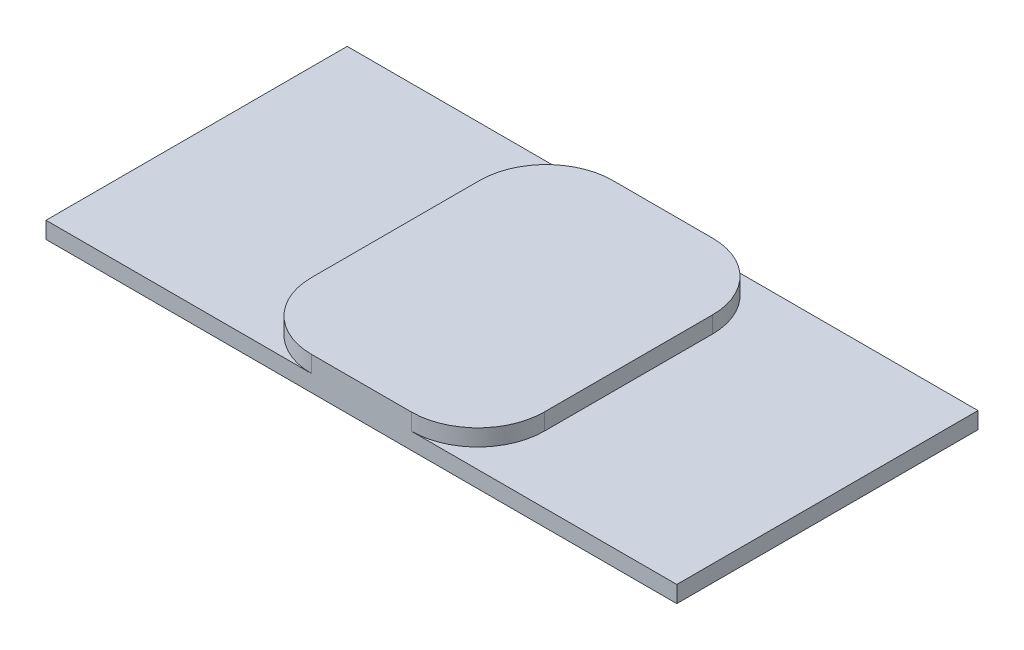
ISO-10303-21;
HEADER;
FILE_DESCRIPTION(('STEP AP214'),'2;1');
FILE_NAME('part.step','',(''),(''),'','','');
FILE_SCHEMA(('AUTOMOTIVE_DESIGN { 1 0 10303 214 1 1 1 1 }'));
ENDSEC;
DATA;
#1=APPLICATION_CONTEXT('core data for automotive mechanical design processes');
#2=APPLICATION_PROTOCOL_DEFINITION('international standard','automotive_design',2000,#1);
#3=PRODUCT_CONTEXT('',#1,'mechanical');
#4=PRODUCT('Part','Part','',(#3));
#5=PRODUCT_RELATED_PRODUCT_CATEGORY('part','',(#4));
#6=PRODUCT_DEFINITION_FORMATION('','',#4);
#7=PRODUCT_DEFINITION_CONTEXT('part definition',#1,'design');
#8=PRODUCT_DEFINITION('design','',#6,#7);
#9=PRODUCT_DEFINITION_SHAPE('','',#8);
#10=(LENGTH_UNIT() NAMED_UNIT(*) SI_UNIT(.MILLI.,.METRE.));
#11=(NAMED_UNIT(*) PLANE_ANGLE_UNIT() SI_UNIT($,.RADIAN.));
#12=(NAMED_UNIT(*) SI_UNIT($,.STERADIAN.) SOLID_ANGLE_UNIT());
#13=UNCERTAINTY_MEASURE_WITH_UNIT(LENGTH_MEASURE(1.E-05),#10,'distance_accuracy_value','');
#14=(GEOMETRIC_REPRESENTATION_CONTEXT(3) GLOBAL_UNCERTAINTY_ASSIGNED_CONTEXT((#13)) GLOBAL_UNIT_ASSIGNED_CONTEXT((#10,
#11,#12)) REPRESENTATION_CONTEXT('',''));
#15=CARTESIAN_POINT('',(0.,0.,0.));
#16=DIRECTION('',(0.,0.,1.));
#17=DIRECTION('',(1.,0.,0.));
#18=AXIS2_PLACEMENT_3D('',#15,#16,#17);
#19=CARTESIAN_POINT('',(0.,6.35,0.));
#20=DIRECTION('',(0.,1.,0.));
#21=DIRECTION('',(0.,0.,1.));
#22=AXIS2_PLACEMENT_3D('',#19,#20,#21);
#23=PLANE('',#22);
#24=DIRECTION('',(0.,0.,-1.));
#25=VECTOR('',#24,1.);
#26=CARTESIAN_POINT('',(44.45,6.35,-57.5));
#27=LINE('',#26,#25);
#28=CARTESIAN_POINT('',(44.45,6.35,32.1));
#29=VERTEX_POINT('',#28);
#30=CARTESIAN_POINT('',(44.45,6.35,-32.1));
#31=VERTEX_POINT('',#30);
#32=EDGE_CURVE('E184',#29,#31,#27,.T.);
#33=ORIENTED_EDGE('',*,*,#32,.F.);
#34=CARTESIAN_POINT('',(19.05,6.35,32.1));
#35=DIRECTION('',(0.,1.,0.));
#36=DIRECTION('',(0.,0.,1.));
#37=AXIS2_PLACEMENT_3D('',#34,#35,#36);
#38=CIRCLE('',#37,25.4);
#39=CARTESIAN_POINT('',(19.05,6.35,57.5));
#40=VERTEX_POINT('',#39);
#41=EDGE_CURVE('E41',#29,#40,#38,.F.);
#42=ORIENTED_EDGE('',*,*,#41,.T.);
#43=DIRECTION('',(1.,0.,0.));
#44=VECTOR('',#43,1.);
#45=CARTESIAN_POINT('',(-120.424999999999,6.35,57.5));
#46=LINE('',#45,#44);
#47=CARTESIAN_POINT('',(120.425000000001,6.35,57.5));
#48=VERTEX_POINT('',#47);
#49=EDGE_CURVE('E48',#40,#48,#46,.T.);
#50=ORIENTED_EDGE('',*,*,#49,.T.);
#51=DIRECTION('',(0.,0.,-1.));
#52=VECTOR('',#51,1.);
#53=CARTESIAN_POINT('',(120.425000000001,6.35,-57.5));
#54=LINE('',#53,#52);
#55=CARTESIAN_POINT('',(120.425000000001,6.35,-57.5));
#56=VERTEX_POINT('',#55);
#57=EDGE_CURVE('E136',#48,#56,#54,.T.);
#58=ORIENTED_EDGE('',*,*,#57,.T.);
#59=DIRECTION('',(-1.,0.,0.));
#60=VECTOR('',#59,1.);
#61=CARTESIAN_POINT('',(-120.424999999999,6.35,-57.5));
#62=LINE('',#61,#60);
#63=CARTESIAN_POINT('',(19.05,6.35,-57.5));
#64=VERTEX_POINT('',#63);
#65=EDGE_CURVE('E121',#56,#64,#62,.T.);
#66=ORIENTED_EDGE('',*,*,#65,.T.);
#67=CARTESIAN_POINT('',(19.05,6.35,-32.1));
#68=DIRECTION('',(0.,1.,0.));
#69=DIRECTION('',(0.,0.,1.));
#70=AXIS2_PLACEMENT_3D('',#67,#68,#69);
#71=CIRCLE('',#70,25.4);
#72=EDGE_CURVE('E181',#64,#31,#71,.F.);
#73=ORIENTED_EDGE('',*,*,#72,.T.);
#74=EDGE_LOOP('',(#33,#42,#50,#58,#66,#73));
#75=FACE_BOUND('',#74,.T.);
#76=ADVANCED_FACE('F33',(#75),#23,.T.);
#77=CARTESIAN_POINT('',(120.425000000001,6.35,-57.5));
#78=DIRECTION('',(-1.,0.,0.));
#79=DIRECTION('',(0.,0.,1.));
#80=AXIS2_PLACEMENT_3D('',#77,#78,#79);
#81=PLANE('',#80);
#82=DIRECTION('',(0.,0.,-1.));
#83=VECTOR('',#82,1.);
#84=CARTESIAN_POINT('',(120.425000000001,0.,-57.5));
#85=LINE('',#84,#83);
#86=CARTESIAN_POINT('',(120.425000000001,0.,57.5));
#87=VERTEX_POINT('',#86);
#88=CARTESIAN_POINT('',(120.425000000001,0.,-57.5));
#89=VERTEX_POINT('',#88);
#90=EDGE_CURVE('E144',#87,#89,#85,.T.);
#91=ORIENTED_EDGE('',*,*,#90,.T.);
#92=DIRECTION('',(0.,-1.,0.));
#93=VECTOR('',#92,1.);
#94=CARTESIAN_POINT('',(120.425000000001,6.35,-57.5));
#95=LINE('',#94,#93);
#96=EDGE_CURVE('E125',#56,#89,#95,.T.);
#97=ORIENTED_EDGE('',*,*,#96,.F.);
#98=ORIENTED_EDGE('',*,*,#57,.F.);
#99=DIRECTION('',(0.,-1.,0.));
#100=VECTOR('',#99,1.);
#101=CARTESIAN_POINT('',(120.425000000001,6.35,57.5));
#102=LINE('',#101,#100);
#103=EDGE_CURVE('E215',#48,#87,#102,.T.);
#104=ORIENTED_EDGE('',*,*,#103,.T.);
#105=EDGE_LOOP('',(#91,#97,#98,#104));
#106=FACE_BOUND('',#105,.T.);
#107=ADVANCED_FACE('F142',(#106),#81,.F.);
#108=CARTESIAN_POINT('',(-120.424999999999,6.35,-57.5));
#109=DIRECTION('',(0.,0.,1.));
#110=DIRECTION('',(1.,0.,0.));
#111=AXIS2_PLACEMENT_3D('',#108,#109,#110);
#112=PLANE('',#111);
#113=CARTESIAN_POINT('',(-19.05,6.35,-57.5));
#114=VERTEX_POINT('',#113);
#115=CARTESIAN_POINT('',(-120.424999999999,6.35,-57.5));
#116=VERTEX_POINT('',#115);
#117=EDGE_CURVE('E133',#114,#116,#62,.T.);
#118=ORIENTED_EDGE('',*,*,#117,.F.);
#119=DIRECTION('',(0.,-1.,0.));
#120=VECTOR('',#119,1.);
#121=CARTESIAN_POINT('',(-19.05,6.35,-57.5));
#122=LINE('',#121,#120);
#123=CARTESIAN_POINT('',(-19.05,12.7,-57.5));
#124=VERTEX_POINT('',#123);
#125=EDGE_CURVE('E158',#114,#124,#122,.F.);
#126=ORIENTED_EDGE('',*,*,#125,.T.);
#127=DIRECTION('',(-1.,0.,0.));
#128=VECTOR('',#127,1.);
#129=CARTESIAN_POINT('',(-44.45,12.7,-57.5));
#130=LINE('',#129,#128);
#131=CARTESIAN_POINT('',(19.05,12.7,-57.5));
#132=VERTEX_POINT('',#131);
#133=EDGE_CURVE('E205',#132,#124,#130,.T.);
#134=ORIENTED_EDGE('',*,*,#133,.F.);
#135=DIRECTION('',(0.,-1.,0.));
#136=VECTOR('',#135,1.);
#137=CARTESIAN_POINT('',(19.05,6.35,-57.5));
#138=LINE('',#137,#136);
#139=EDGE_CURVE('E129',#132,#64,#138,.T.);
#140=ORIENTED_EDGE('',*,*,#139,.T.);
#141=ORIENTED_EDGE('',*,*,#65,.F.);
#142=ORIENTED_EDGE('',*,*,#96,.T.);
#143=DIRECTION('',(-1.,0.,0.));
#144=VECTOR('',#143,1.);
#145=CARTESIAN_POINT('',(-120.424999999999,0.,-57.5));
#146=LINE('',#145,#144);
#147=CARTESIAN_POINT('',(-120.424999999999,0.,-57.5));
#148=VERTEX_POINT('',#147);
#149=EDGE_CURVE('E203',#89,#148,#146,.T.);
#150=ORIENTED_EDGE('',*,*,#149,.T.);
#151=DIRECTION('',(0.,-1.,0.));
#152=VECTOR('',#151,1.);
#153=CARTESIAN_POINT('',(-120.424999999999,6.35,-57.5));
#154=LINE('',#153,#152);
#155=EDGE_CURVE('E146',#116,#148,#154,.T.);
#156=ORIENTED_EDGE('',*,*,#155,.F.);
#157=EDGE_LOOP('',(#118,#126,#134,#140,#141,#142,#150,#156));
#158=FACE_BOUND('',#157,.T.);
#159=ADVANCED_FACE('F123',(#158),#112,.F.);
#160=CARTESIAN_POINT('',(-120.424999999999,6.35,-57.5));
#161=DIRECTION('',(1.,0.,0.));
#162=DIRECTION('',(0.,0.,-1.));
#163=AXIS2_PLACEMENT_3D('',#160,#161,#162);
#164=PLANE('',#163);
#165=DIRECTION('',(0.,0.,1.));
#166=VECTOR('',#165,1.);
#167=CARTESIAN_POINT('',(-120.424999999999,0.,-57.5));
#168=LINE('',#167,#166);
#169=CARTESIAN_POINT('',(-120.424999999999,0.,57.5));
#170=VERTEX_POINT('',#169);
#171=EDGE_CURVE('E218',#148,#170,#168,.T.);
#172=ORIENTED_EDGE('',*,*,#171,.T.);
#173=DIRECTION('',(0.,-1.,0.));
#174=VECTOR('',#173,1.);
#175=CARTESIAN_POINT('',(-120.424999999999,6.35,57.5));
#176=LINE('',#175,#174);
#177=CARTESIAN_POINT('',(-120.424999999999,6.35,57.5));
#178=VERTEX_POINT('',#177);
#179=EDGE_CURVE('E151',#178,#170,#176,.T.);
#180=ORIENTED_EDGE('',*,*,#179,.F.);
#181=DIRECTION('',(0.,0.,1.));
#182=VECTOR('',#181,1.);
#183=CARTESIAN_POINT('',(-120.424999999999,6.35,-57.5));
#184=LINE('',#183,#182);
#185=EDGE_CURVE('E132',#116,#178,#184,.T.);
#186=ORIENTED_EDGE('',*,*,#185,.F.);
#187=ORIENTED_EDGE('',*,*,#155,.T.);
#188=EDGE_LOOP('',(#172,#180,#186,#187));
#189=FACE_BOUND('',#188,.T.);
#190=ADVANCED_FACE('F230',(#189),#164,.F.);
#191=CARTESIAN_POINT('',(-120.424999999999,6.35,57.5));
#192=DIRECTION('',(0.,0.,-1.));
#193=DIRECTION('',(-1.,0.,0.));
#194=AXIS2_PLACEMENT_3D('',#191,#192,#193);
#195=PLANE('',#194);
#196=ORIENTED_EDGE('',*,*,#49,.F.);
#197=DIRECTION('',(0.,-1.,0.));
#198=VECTOR('',#197,1.);
#199=CARTESIAN_POINT('',(19.05,6.35,57.5));
#200=LINE('',#199,#198);
#201=CARTESIAN_POINT('',(19.05,12.7,57.5));
#202=VERTEX_POINT('',#201);
#203=EDGE_CURVE('E176',#40,#202,#200,.F.);
#204=ORIENTED_EDGE('',*,*,#203,.T.);
#205=DIRECTION('',(1.,0.,0.));
#206=VECTOR('',#205,1.);
#207=CARTESIAN_POINT('',(-44.45,12.7,57.5));
#208=LINE('',#207,#206);
#209=CARTESIAN_POINT('',(-19.05,12.7,57.5));
#210=VERTEX_POINT('',#209);
#211=EDGE_CURVE('E192',#210,#202,#208,.T.);
#212=ORIENTED_EDGE('',*,*,#211,.F.);
#213=DIRECTION('',(0.,-1.,0.));
#214=VECTOR('',#213,1.);
#215=CARTESIAN_POINT('',(-19.05,6.35,57.5));
#216=LINE('',#215,#214);
#217=CARTESIAN_POINT('',(-19.05,6.35,57.5));
#218=VERTEX_POINT('',#217);
#219=EDGE_CURVE('E173',#210,#218,#216,.T.);
#220=ORIENTED_EDGE('',*,*,#219,.T.);
#221=EDGE_CURVE('E55',#178,#218,#46,.T.);
#222=ORIENTED_EDGE('',*,*,#221,.F.);
#223=ORIENTED_EDGE('',*,*,#179,.T.);
#224=DIRECTION('',(1.,0.,0.));
#225=VECTOR('',#224,1.);
#226=CARTESIAN_POINT('',(-120.424999999999,0.,57.5));
#227=LINE('',#226,#225);
#228=EDGE_CURVE('E140',#170,#87,#227,.T.);
#229=ORIENTED_EDGE('',*,*,#228,.T.);
#230=ORIENTED_EDGE('',*,*,#103,.F.);
#231=EDGE_LOOP('',(#196,#204,#212,#220,#222,#223,#229,#230));
#232=FACE_BOUND('',#231,.T.);
#233=ADVANCED_FACE('F191',(#232),#195,.F.);
#234=DIRECTION('',(0.,0.,1.));
#235=VECTOR('',#234,1.);
#236=CARTESIAN_POINT('',(-44.45,6.35,-57.5));
#237=LINE('',#236,#235);
#238=CARTESIAN_POINT('',(-44.45,6.35,-32.1));
#239=VERTEX_POINT('',#238);
#240=CARTESIAN_POINT('',(-44.45,6.35,32.1));
#241=VERTEX_POINT('',#240);
#242=EDGE_CURVE('E210',#239,#241,#237,.T.);
#243=ORIENTED_EDGE('',*,*,#242,.F.);
#244=CARTESIAN_POINT('',(-19.05,6.35,-32.1));
#245=DIRECTION('',(0.,1.,0.));
#246=DIRECTION('',(0.,0.,1.));
#247=AXIS2_PLACEMENT_3D('',#244,#245,#246);
#248=CIRCLE('',#247,25.4);
#249=EDGE_CURVE('E178',#239,#114,#248,.F.);
#250=ORIENTED_EDGE('',*,*,#249,.T.);
#251=ORIENTED_EDGE('',*,*,#117,.T.);
#252=ORIENTED_EDGE('',*,*,#185,.T.);
#253=ORIENTED_EDGE('',*,*,#221,.T.);
#254=CARTESIAN_POINT('',(-19.05,6.35,32.1));
#255=DIRECTION('',(0.,1.,0.));
#256=DIRECTION('',(0.,0.,1.));
#257=AXIS2_PLACEMENT_3D('',#254,#255,#256);
#258=CIRCLE('',#257,25.4);
#259=EDGE_CURVE('E11',#218,#241,#258,.F.);
#260=ORIENTED_EDGE('',*,*,#259,.T.);
#261=EDGE_LOOP('',(#243,#250,#251,#252,#253,#260));
#262=FACE_BOUND('',#261,.T.);
#263=ADVANCED_FACE('F232',(#262),#23,.T.);
#264=CARTESIAN_POINT('',(0.,0.,0.));
#265=DIRECTION('',(0.,1.,0.));
#266=DIRECTION('',(0.,0.,1.));
#267=AXIS2_PLACEMENT_3D('',#264,#265,#266);
#268=PLANE('',#267);
#269=ORIENTED_EDGE('',*,*,#90,.F.);
#270=ORIENTED_EDGE('',*,*,#228,.F.);
#271=ORIENTED_EDGE('',*,*,#171,.F.);
#272=ORIENTED_EDGE('',*,*,#149,.F.);
#273=EDGE_LOOP('',(#269,#270,#271,#272));
#274=FACE_BOUND('',#273,.T.);
#275=ADVANCED_FACE('F228',(#274),#268,.F.);
#276=CARTESIAN_POINT('',(44.45,12.7,-57.5));
#277=DIRECTION('',(-1.,0.,0.));
#278=DIRECTION('',(0.,0.,1.));
#279=AXIS2_PLACEMENT_3D('',#276,#277,#278);
#280=PLANE('',#279);
#281=ORIENTED_EDGE('',*,*,#32,.T.);
#282=DIRECTION('',(0.,-1.,0.));
#283=VECTOR('',#282,1.);
#284=CARTESIAN_POINT('',(44.45,12.7,-32.1));
#285=LINE('',#284,#283);
#286=CARTESIAN_POINT('',(44.45,12.7,-32.1));
#287=VERTEX_POINT('',#286);
#288=EDGE_CURVE('E171',#31,#287,#285,.F.);
#289=ORIENTED_EDGE('',*,*,#288,.T.);
#290=DIRECTION('',(0.,0.,-1.));
#291=VECTOR('',#290,1.);
#292=CARTESIAN_POINT('',(44.45,12.7,-57.5));
#293=LINE('',#292,#291);
#294=CARTESIAN_POINT('',(44.45,12.7,32.1));
#295=VERTEX_POINT('',#294);
#296=EDGE_CURVE('E212',#295,#287,#293,.T.);
#297=ORIENTED_EDGE('',*,*,#296,.F.);
#298=DIRECTION('',(0.,-1.,0.));
#299=VECTOR('',#298,1.);
#300=CARTESIAN_POINT('',(44.45,12.7,32.1));
#301=LINE('',#300,#299);
#302=EDGE_CURVE('E168',#295,#29,#301,.T.);
#303=ORIENTED_EDGE('',*,*,#302,.T.);
#304=EDGE_LOOP('',(#281,#289,#297,#303));
#305=FACE_BOUND('',#304,.T.);
#306=ADVANCED_FACE('F265',(#305),#280,.F.);
#307=CARTESIAN_POINT('',(-44.45,12.7,-57.5));
#308=DIRECTION('',(1.,0.,0.));
#309=DIRECTION('',(0.,0.,-1.));
#310=AXIS2_PLACEMENT_3D('',#307,#308,#309);
#311=PLANE('',#310);
#312=DIRECTION('',(0.,0.,1.));
#313=VECTOR('',#312,1.);
#314=CARTESIAN_POINT('',(-44.45,12.7,-57.5));
#315=LINE('',#314,#313);
#316=CARTESIAN_POINT('',(-44.45,12.7,-32.1));
#317=VERTEX_POINT('',#316);
#318=CARTESIAN_POINT('',(-44.45,12.7,32.1));
#319=VERTEX_POINT('',#318);
#320=EDGE_CURVE('E201',#317,#319,#315,.T.);
#321=ORIENTED_EDGE('',*,*,#320,.F.);
#322=DIRECTION('',(0.,-1.,0.));
#323=VECTOR('',#322,1.);
#324=CARTESIAN_POINT('',(-44.45,12.7,-32.1));
#325=LINE('',#324,#323);
#326=EDGE_CURVE('E148',#317,#239,#325,.T.);
#327=ORIENTED_EDGE('',*,*,#326,.T.);
#328=ORIENTED_EDGE('',*,*,#242,.T.);
#329=DIRECTION('',(0.,-1.,0.));
#330=VECTOR('',#329,1.);
#331=CARTESIAN_POINT('',(-44.45,12.7,32.1));
#332=LINE('',#331,#330);
#333=EDGE_CURVE('E145',#241,#319,#332,.F.);
#334=ORIENTED_EDGE('',*,*,#333,.T.);
#335=EDGE_LOOP('',(#321,#327,#328,#334));
#336=FACE_BOUND('',#335,.T.);
#337=ADVANCED_FACE('F241',(#336),#311,.F.);
#338=CARTESIAN_POINT('',(0.,12.7,0.));
#339=DIRECTION('',(0.,1.,0.));
#340=DIRECTION('',(0.,0.,1.));
#341=AXIS2_PLACEMENT_3D('',#338,#339,#340);
#342=PLANE('',#341);
#343=ORIENTED_EDGE('',*,*,#133,.T.);
#344=CARTESIAN_POINT('',(-19.05,12.7,-32.1));
#345=DIRECTION('',(0.,1.,0.));
#346=DIRECTION('',(0.,0.,1.));
#347=AXIS2_PLACEMENT_3D('',#344,#345,#346);
#348=CIRCLE('',#347,25.4);
#349=EDGE_CURVE('E166',#124,#317,#348,.T.);
#350=ORIENTED_EDGE('',*,*,#349,.T.);
#351=ORIENTED_EDGE('',*,*,#320,.T.);
#352=CARTESIAN_POINT('',(-19.05,12.7,32.1));
#353=DIRECTION('',(0.,1.,0.));
#354=DIRECTION('',(0.,0.,1.));
#355=AXIS2_PLACEMENT_3D('',#352,#353,#354);
#356=CIRCLE('',#355,25.4);
#357=EDGE_CURVE('E160',#319,#210,#356,.T.);
#358=ORIENTED_EDGE('',*,*,#357,.T.);
#359=ORIENTED_EDGE('',*,*,#211,.T.);
#360=CARTESIAN_POINT('',(19.05,12.7,32.1));
#361=DIRECTION('',(0.,1.,0.));
#362=DIRECTION('',(0.,0.,1.));
#363=AXIS2_PLACEMENT_3D('',#360,#361,#362);
#364=CIRCLE('',#363,25.4);
#365=EDGE_CURVE('E162',#202,#295,#364,.T.);
#366=ORIENTED_EDGE('',*,*,#365,.T.);
#367=ORIENTED_EDGE('',*,*,#296,.T.);
#368=CARTESIAN_POINT('',(19.05,12.7,-32.1));
#369=DIRECTION('',(0.,1.,0.));
#370=DIRECTION('',(0.,0.,1.));
#371=AXIS2_PLACEMENT_3D('',#368,#369,#370);
#372=CIRCLE('',#371,25.4);
#373=EDGE_CURVE('E164',#287,#132,#372,.T.);
#374=ORIENTED_EDGE('',*,*,#373,.T.);
#375=EDGE_LOOP('',(#343,#350,#351,#358,#359,#366,#367,#374));
#376=FACE_BOUND('',#375,.T.);
#377=ADVANCED_FACE('F196',(#376),#342,.T.);
#378=CARTESIAN_POINT('',(-19.05,12.7,-32.1));
#379=DIRECTION('',(0.,-1.,0.));
#380=DIRECTION('',(0.,0.,-1.));
#381=AXIS2_PLACEMENT_3D('',#378,#379,#380);
#382=CYLINDRICAL_SURFACE('',#381,25.4);
#383=ORIENTED_EDGE('',*,*,#349,.F.);
#384=ORIENTED_EDGE('',*,*,#125,.F.);
#385=ORIENTED_EDGE('',*,*,#249,.F.);
#386=ORIENTED_EDGE('',*,*,#326,.F.);
#387=EDGE_LOOP('',(#383,#384,#385,#386));
#388=FACE_BOUND('',#387,.T.);
#389=ADVANCED_FACE('F239',(#388),#382,.T.);
#390=CARTESIAN_POINT('',(19.05,6.35,-32.1));
#391=DIRECTION('',(0.,-1.,0.));
#392=DIRECTION('',(0.,0.,-1.));
#393=AXIS2_PLACEMENT_3D('',#390,#391,#392);
#394=CYLINDRICAL_SURFACE('',#393,25.4);
#395=ORIENTED_EDGE('',*,*,#373,.F.);
#396=ORIENTED_EDGE('',*,*,#288,.F.);
#397=ORIENTED_EDGE('',*,*,#72,.F.);
#398=ORIENTED_EDGE('',*,*,#139,.F.);
#399=EDGE_LOOP('',(#395,#396,#397,#398));
#400=FACE_BOUND('',#399,.T.);
#401=ADVANCED_FACE('F248',(#400),#394,.T.);
#402=CARTESIAN_POINT('',(19.05,12.7,32.1));
#403=DIRECTION('',(0.,-1.,0.));
#404=DIRECTION('',(0.,0.,-1.));
#405=AXIS2_PLACEMENT_3D('',#402,#403,#404);
#406=CYLINDRICAL_SURFACE('',#405,25.4);
#407=ORIENTED_EDGE('',*,*,#365,.F.);
#408=ORIENTED_EDGE('',*,*,#203,.F.);
#409=ORIENTED_EDGE('',*,*,#41,.F.);
#410=ORIENTED_EDGE('',*,*,#302,.F.);
#411=EDGE_LOOP('',(#407,#408,#409,#410));
#412=FACE_BOUND('',#411,.T.);
#413=ADVANCED_FACE('F188',(#412),#406,.T.);
#414=CARTESIAN_POINT('',(-19.05,6.35,32.1));
#415=DIRECTION('',(0.,-1.,0.));
#416=DIRECTION('',(0.,0.,-1.));
#417=AXIS2_PLACEMENT_3D('',#414,#415,#416);
#418=CYLINDRICAL_SURFACE('',#417,25.4);
#419=ORIENTED_EDGE('',*,*,#357,.F.);
#420=ORIENTED_EDGE('',*,*,#333,.F.);
#421=ORIENTED_EDGE('',*,*,#259,.F.);
#422=ORIENTED_EDGE('',*,*,#219,.F.);
#423=EDGE_LOOP('',(#419,#420,#421,#422));
#424=FACE_BOUND('',#423,.T.);
#425=ADVANCED_FACE('F35',(#424),#418,.T.);
#426=CLOSED_SHELL('',(#76,#107,#159,#190,#233,#263,#275,#306,#337,#377,#389,#401,#413,#425));
#427=MANIFOLD_SOLID_BREP('B2',#426);
#428=ADVANCED_BREP_SHAPE_REPRESENTATION('',(#18,#427),#14);
#429=SHAPE_DEFINITION_REPRESENTATION(#9,#428);
ENDSEC;
END-ISO-10303-21;
